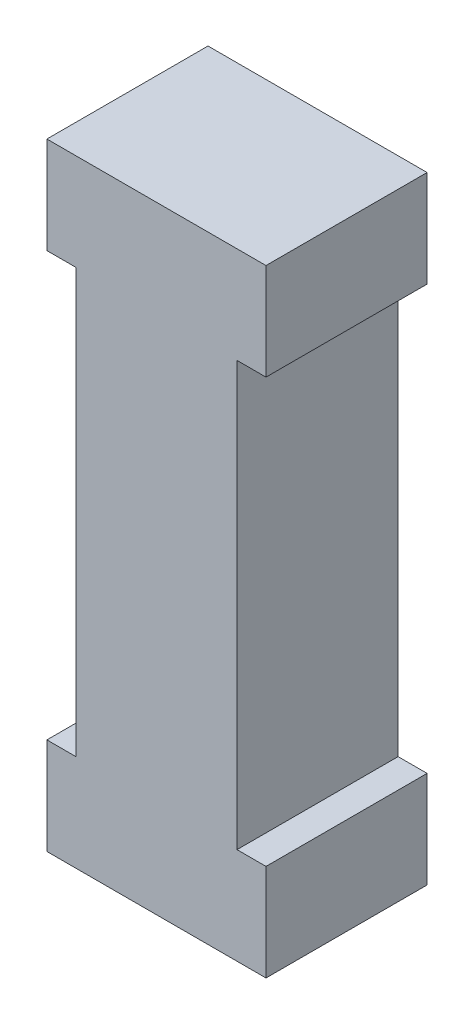
ISO-10303-21;
HEADER;
FILE_DESCRIPTION(('STEP AP214'),'2;1');
FILE_NAME('part.step','',(''),(''),'','','');
FILE_SCHEMA(('AUTOMOTIVE_DESIGN { 1 0 10303 214 1 1 1 1 }'));
ENDSEC;
DATA;
#1=APPLICATION_CONTEXT('core data for automotive mechanical design processes');
#2=APPLICATION_PROTOCOL_DEFINITION('international standard','automotive_design',2000,#1);
#3=PRODUCT_CONTEXT('',#1,'mechanical');
#4=PRODUCT('Part','Part','',(#3));
#5=PRODUCT_RELATED_PRODUCT_CATEGORY('part','',(#4));
#6=PRODUCT_DEFINITION_FORMATION('','',#4);
#7=PRODUCT_DEFINITION_CONTEXT('part definition',#1,'design');
#8=PRODUCT_DEFINITION('design','',#6,#7);
#9=PRODUCT_DEFINITION_SHAPE('','',#8);
#10=(LENGTH_UNIT() NAMED_UNIT(*) SI_UNIT(.MILLI.,.METRE.));
#11=(NAMED_UNIT(*) PLANE_ANGLE_UNIT() SI_UNIT($,.RADIAN.));
#12=(NAMED_UNIT(*) SI_UNIT($,.STERADIAN.) SOLID_ANGLE_UNIT());
#13=UNCERTAINTY_MEASURE_WITH_UNIT(LENGTH_MEASURE(1.E-05),#10,'distance_accuracy_value','');
#14=(GEOMETRIC_REPRESENTATION_CONTEXT(3) GLOBAL_UNCERTAINTY_ASSIGNED_CONTEXT((#13)) GLOBAL_UNIT_ASSIGNED_CONTEXT((#10,
#11,#12)) REPRESENTATION_CONTEXT('',''));
#15=CARTESIAN_POINT('',(0.,0.,0.));
#16=DIRECTION('',(0.,0.,1.));
#17=DIRECTION('',(1.,0.,0.));
#18=AXIS2_PLACEMENT_3D('',#15,#16,#17);
#19=CARTESIAN_POINT('',(0.,0.,5.));
#20=DIRECTION('',(0.,-1.,0.));
#21=DIRECTION('',(1.,0.,0.));
#22=AXIS2_PLACEMENT_3D('',#19,#20,#21);
#23=PLANE('',#22);
#24=DIRECTION('',(-1.,0.,0.));
#25=VECTOR('',#24,1.);
#26=CARTESIAN_POINT('',(0.,0.,0.));
#27=LINE('',#26,#25);
#28=CARTESIAN_POINT('',(0.900000000000002,0.,0.));
#29=VERTEX_POINT('',#28);
#30=CARTESIAN_POINT('',(0.,0.,0.));
#31=VERTEX_POINT('',#30);
#32=EDGE_CURVE('E159',#29,#31,#27,.T.);
#33=ORIENTED_EDGE('',*,*,#32,.T.);
#34=DIRECTION('',(0.,0.,-1.));
#35=VECTOR('',#34,1.);
#36=CARTESIAN_POINT('',(0.,0.,5.));
#37=LINE('',#36,#35);
#38=CARTESIAN_POINT('',(0.,0.,5.));
#39=VERTEX_POINT('',#38);
#40=EDGE_CURVE('E11',#39,#31,#37,.T.);
#41=ORIENTED_EDGE('',*,*,#40,.F.);
#42=DIRECTION('',(-1.,0.,0.));
#43=VECTOR('',#42,1.);
#44=CARTESIAN_POINT('',(0.,0.,5.));
#45=LINE('',#44,#43);
#46=CARTESIAN_POINT('',(0.900000000000002,0.,5.));
#47=VERTEX_POINT('',#46);
#48=EDGE_CURVE('E181',#47,#39,#45,.T.);
#49=ORIENTED_EDGE('',*,*,#48,.F.);
#50=DIRECTION('',(0.,0.,-1.));
#51=VECTOR('',#50,1.);
#52=CARTESIAN_POINT('',(0.900000000000002,0.,5.));
#53=LINE('',#52,#51);
#54=EDGE_CURVE('E155',#47,#29,#53,.T.);
#55=ORIENTED_EDGE('',*,*,#54,.T.);
#56=EDGE_LOOP('',(#33,#41,#49,#55));
#57=FACE_BOUND('',#56,.T.);
#58=ADVANCED_FACE('F39',(#57),#23,.F.);
#59=CARTESIAN_POINT('',(0.,0.,5.));
#60=DIRECTION('',(-1.,0.,0.));
#61=DIRECTION('',(0.,0.,1.));
#62=AXIS2_PLACEMENT_3D('',#59,#60,#61);
#63=PLANE('',#62);
#64=DIRECTION('',(0.,1.,0.));
#65=VECTOR('',#64,1.);
#66=CARTESIAN_POINT('',(0.,0.,0.));
#67=LINE('',#66,#65);
#68=CARTESIAN_POINT('',(0.,13.15,0.));
#69=VERTEX_POINT('',#68);
#70=EDGE_CURVE('E162',#31,#69,#67,.T.);
#71=ORIENTED_EDGE('',*,*,#70,.T.);
#72=DIRECTION('',(0.,0.,-1.));
#73=VECTOR('',#72,1.);
#74=CARTESIAN_POINT('',(0.,13.15,5.));
#75=LINE('',#74,#73);
#76=CARTESIAN_POINT('',(0.,13.15,5.));
#77=VERTEX_POINT('',#76);
#78=EDGE_CURVE('E47',#77,#69,#75,.T.);
#79=ORIENTED_EDGE('',*,*,#78,.F.);
#80=DIRECTION('',(0.,1.,0.));
#81=VECTOR('',#80,1.);
#82=CARTESIAN_POINT('',(0.,0.,5.));
#83=LINE('',#82,#81);
#84=EDGE_CURVE('E110',#39,#77,#83,.T.);
#85=ORIENTED_EDGE('',*,*,#84,.F.);
#86=ORIENTED_EDGE('',*,*,#40,.T.);
#87=EDGE_LOOP('',(#71,#79,#85,#86));
#88=FACE_BOUND('',#87,.T.);
#89=ADVANCED_FACE('F259',(#88),#63,.F.);
#90=CARTESIAN_POINT('',(0.,13.15,5.));
#91=DIRECTION('',(0.,1.,0.));
#92=DIRECTION('',(-1.,0.,0.));
#93=AXIS2_PLACEMENT_3D('',#90,#91,#92);
#94=PLANE('',#93);
#95=DIRECTION('',(1.,0.,0.));
#96=VECTOR('',#95,1.);
#97=CARTESIAN_POINT('',(0.,13.15,0.));
#98=LINE('',#97,#96);
#99=CARTESIAN_POINT('',(0.899999999999993,13.15,0.));
#100=VERTEX_POINT('',#99);
#101=EDGE_CURVE('E164',#69,#100,#98,.T.);
#102=ORIENTED_EDGE('',*,*,#101,.T.);
#103=DIRECTION('',(0.,0.,-1.));
#104=VECTOR('',#103,1.);
#105=CARTESIAN_POINT('',(0.899999999999993,13.15,5.));
#106=LINE('',#105,#104);
#107=CARTESIAN_POINT('',(0.899999999999993,13.15,5.));
#108=VERTEX_POINT('',#107);
#109=EDGE_CURVE('E200',#108,#100,#106,.T.);
#110=ORIENTED_EDGE('',*,*,#109,.F.);
#111=DIRECTION('',(1.,0.,0.));
#112=VECTOR('',#111,1.);
#113=CARTESIAN_POINT('',(0.,13.15,5.));
#114=LINE('',#113,#112);
#115=EDGE_CURVE('E208',#77,#108,#114,.T.);
#116=ORIENTED_EDGE('',*,*,#115,.F.);
#117=ORIENTED_EDGE('',*,*,#78,.T.);
#118=EDGE_LOOP('',(#102,#110,#116,#117));
#119=FACE_BOUND('',#118,.T.);
#120=ADVANCED_FACE('F206',(#119),#94,.F.);
#121=CARTESIAN_POINT('',(0.899999999999991,16.15,5.));
#122=DIRECTION('',(-1.,0.,0.));
#123=DIRECTION('',(0.,-1.,0.));
#124=AXIS2_PLACEMENT_3D('',#121,#122,#123);
#125=PLANE('',#124);
#126=DIRECTION('',(0.,1.,0.));
#127=VECTOR('',#126,1.);
#128=CARTESIAN_POINT('',(0.899999999999991,16.15,0.));
#129=LINE('',#128,#127);
#130=CARTESIAN_POINT('',(0.899999999999991,16.15,0.));
#131=VERTEX_POINT('',#130);
#132=EDGE_CURVE('E166',#100,#131,#129,.T.);
#133=ORIENTED_EDGE('',*,*,#132,.T.);
#134=DIRECTION('',(0.,0.,-1.));
#135=VECTOR('',#134,1.);
#136=CARTESIAN_POINT('',(0.899999999999991,16.15,5.));
#137=LINE('',#136,#135);
#138=CARTESIAN_POINT('',(0.899999999999991,16.15,5.));
#139=VERTEX_POINT('',#138);
#140=EDGE_CURVE('E197',#139,#131,#137,.T.);
#141=ORIENTED_EDGE('',*,*,#140,.F.);
#142=DIRECTION('',(0.,1.,0.));
#143=VECTOR('',#142,1.);
#144=CARTESIAN_POINT('',(0.899999999999991,16.15,5.));
#145=LINE('',#144,#143);
#146=EDGE_CURVE('E226',#108,#139,#145,.T.);
#147=ORIENTED_EDGE('',*,*,#146,.F.);
#148=ORIENTED_EDGE('',*,*,#109,.T.);
#149=EDGE_LOOP('',(#133,#141,#147,#148));
#150=FACE_BOUND('',#149,.T.);
#151=ADVANCED_FACE('F217',(#150),#125,.F.);
#152=CARTESIAN_POINT('',(-5.90000000000001,16.15,5.));
#153=DIRECTION('',(0.,-1.,0.));
#154=DIRECTION('',(1.,0.,0.));
#155=AXIS2_PLACEMENT_3D('',#152,#153,#154);
#156=PLANE('',#155);
#157=DIRECTION('',(-1.,0.,0.));
#158=VECTOR('',#157,1.);
#159=CARTESIAN_POINT('',(-5.90000000000001,16.15,0.));
#160=LINE('',#159,#158);
#161=CARTESIAN_POINT('',(-5.90000000000001,16.15,0.));
#162=VERTEX_POINT('',#161);
#163=EDGE_CURVE('E168',#131,#162,#160,.T.);
#164=ORIENTED_EDGE('',*,*,#163,.T.);
#165=DIRECTION('',(0.,0.,-1.));
#166=VECTOR('',#165,1.);
#167=CARTESIAN_POINT('',(-5.90000000000001,16.15,5.));
#168=LINE('',#167,#166);
#169=CARTESIAN_POINT('',(-5.90000000000001,16.15,5.));
#170=VERTEX_POINT('',#169);
#171=EDGE_CURVE('E194',#170,#162,#168,.T.);
#172=ORIENTED_EDGE('',*,*,#171,.F.);
#173=DIRECTION('',(-1.,0.,0.));
#174=VECTOR('',#173,1.);
#175=CARTESIAN_POINT('',(-5.90000000000001,16.15,5.));
#176=LINE('',#175,#174);
#177=EDGE_CURVE('E223',#139,#170,#176,.T.);
#178=ORIENTED_EDGE('',*,*,#177,.F.);
#179=ORIENTED_EDGE('',*,*,#140,.T.);
#180=EDGE_LOOP('',(#164,#172,#178,#179));
#181=FACE_BOUND('',#180,.T.);
#182=ADVANCED_FACE('F221',(#181),#156,.F.);
#183=CARTESIAN_POINT('',(-5.90000000000001,16.15,5.));
#184=DIRECTION('',(1.,0.,0.));
#185=DIRECTION('',(0.,0.,-1.));
#186=AXIS2_PLACEMENT_3D('',#183,#184,#185);
#187=PLANE('',#186);
#188=DIRECTION('',(0.,-1.,0.));
#189=VECTOR('',#188,1.);
#190=CARTESIAN_POINT('',(-5.90000000000001,16.15,0.));
#191=LINE('',#190,#189);
#192=CARTESIAN_POINT('',(-5.90000000000001,13.15,0.));
#193=VERTEX_POINT('',#192);
#194=EDGE_CURVE('E170',#162,#193,#191,.T.);
#195=ORIENTED_EDGE('',*,*,#194,.T.);
#196=DIRECTION('',(0.,0.,-1.));
#197=VECTOR('',#196,1.);
#198=CARTESIAN_POINT('',(-5.90000000000001,13.15,5.));
#199=LINE('',#198,#197);
#200=CARTESIAN_POINT('',(-5.90000000000001,13.15,5.));
#201=VERTEX_POINT('',#200);
#202=EDGE_CURVE('E191',#201,#193,#199,.T.);
#203=ORIENTED_EDGE('',*,*,#202,.F.);
#204=DIRECTION('',(0.,-1.,0.));
#205=VECTOR('',#204,1.);
#206=CARTESIAN_POINT('',(-5.90000000000001,16.15,5.));
#207=LINE('',#206,#205);
#208=EDGE_CURVE('E225',#170,#201,#207,.T.);
#209=ORIENTED_EDGE('',*,*,#208,.F.);
#210=ORIENTED_EDGE('',*,*,#171,.T.);
#211=EDGE_LOOP('',(#195,#203,#209,#210));
#212=FACE_BOUND('',#211,.T.);
#213=ADVANCED_FACE('F272',(#212),#187,.F.);
#214=CARTESIAN_POINT('',(-5.90000000000001,13.15,5.));
#215=DIRECTION('',(0.,1.,0.));
#216=DIRECTION('',(0.,0.,1.));
#217=AXIS2_PLACEMENT_3D('',#214,#215,#216);
#218=PLANE('',#217);
#219=DIRECTION('',(1.,0.,0.));
#220=VECTOR('',#219,1.);
#221=CARTESIAN_POINT('',(-5.90000000000001,13.15,0.));
#222=LINE('',#221,#220);
#223=CARTESIAN_POINT('',(-5.,13.15,0.));
#224=VERTEX_POINT('',#223);
#225=EDGE_CURVE('E172',#193,#224,#222,.T.);
#226=ORIENTED_EDGE('',*,*,#225,.T.);
#227=DIRECTION('',(0.,0.,-1.));
#228=VECTOR('',#227,1.);
#229=CARTESIAN_POINT('',(-5.,13.15,5.));
#230=LINE('',#229,#228);
#231=CARTESIAN_POINT('',(-5.,13.15,5.));
#232=VERTEX_POINT('',#231);
#233=EDGE_CURVE('E188',#232,#224,#230,.T.);
#234=ORIENTED_EDGE('',*,*,#233,.F.);
#235=DIRECTION('',(1.,0.,0.));
#236=VECTOR('',#235,1.);
#237=CARTESIAN_POINT('',(-5.90000000000001,13.15,5.));
#238=LINE('',#237,#236);
#239=EDGE_CURVE('E228',#201,#232,#238,.T.);
#240=ORIENTED_EDGE('',*,*,#239,.F.);
#241=ORIENTED_EDGE('',*,*,#202,.T.);
#242=EDGE_LOOP('',(#226,#234,#240,#241));
#243=FACE_BOUND('',#242,.T.);
#244=ADVANCED_FACE('F275',(#243),#218,.F.);
#245=CARTESIAN_POINT('',(-5.,0.,5.));
#246=DIRECTION('',(1.,0.,0.));
#247=DIRECTION('',(0.,1.,0.));
#248=AXIS2_PLACEMENT_3D('',#245,#246,#247);
#249=PLANE('',#248);
#250=DIRECTION('',(0.,-1.,0.));
#251=VECTOR('',#250,1.);
#252=CARTESIAN_POINT('',(-5.,0.,0.));
#253=LINE('',#252,#251);
#254=CARTESIAN_POINT('',(-5.,0.,0.));
#255=VERTEX_POINT('',#254);
#256=EDGE_CURVE('E174',#224,#255,#253,.T.);
#257=ORIENTED_EDGE('',*,*,#256,.T.);
#258=DIRECTION('',(0.,0.,-1.));
#259=VECTOR('',#258,1.);
#260=CARTESIAN_POINT('',(-5.,0.,5.));
#261=LINE('',#260,#259);
#262=CARTESIAN_POINT('',(-5.,0.,5.));
#263=VERTEX_POINT('',#262);
#264=EDGE_CURVE('E185',#263,#255,#261,.T.);
#265=ORIENTED_EDGE('',*,*,#264,.F.);
#266=DIRECTION('',(0.,-1.,0.));
#267=VECTOR('',#266,1.);
#268=CARTESIAN_POINT('',(-5.,0.,5.));
#269=LINE('',#268,#267);
#270=EDGE_CURVE('E234',#232,#263,#269,.T.);
#271=ORIENTED_EDGE('',*,*,#270,.F.);
#272=ORIENTED_EDGE('',*,*,#233,.T.);
#273=EDGE_LOOP('',(#257,#265,#271,#272));
#274=FACE_BOUND('',#273,.T.);
#275=ADVANCED_FACE('F240',(#274),#249,.F.);
#276=CARTESIAN_POINT('',(-5.9,0.,5.));
#277=DIRECTION('',(0.,-1.,0.));
#278=DIRECTION('',(1.,0.,0.));
#279=AXIS2_PLACEMENT_3D('',#276,#277,#278);
#280=PLANE('',#279);
#281=DIRECTION('',(-1.,0.,0.));
#282=VECTOR('',#281,1.);
#283=CARTESIAN_POINT('',(-5.9,0.,0.));
#284=LINE('',#283,#282);
#285=CARTESIAN_POINT('',(-5.9,0.,0.));
#286=VERTEX_POINT('',#285);
#287=EDGE_CURVE('E176',#255,#286,#284,.T.);
#288=ORIENTED_EDGE('',*,*,#287,.T.);
#289=DIRECTION('',(0.,0.,-1.));
#290=VECTOR('',#289,1.);
#291=CARTESIAN_POINT('',(-5.9,0.,5.));
#292=LINE('',#291,#290);
#293=CARTESIAN_POINT('',(-5.9,0.,5.));
#294=VERTEX_POINT('',#293);
#295=EDGE_CURVE('E150',#294,#286,#292,.T.);
#296=ORIENTED_EDGE('',*,*,#295,.F.);
#297=DIRECTION('',(-1.,0.,0.));
#298=VECTOR('',#297,1.);
#299=CARTESIAN_POINT('',(-5.9,0.,5.));
#300=LINE('',#299,#298);
#301=EDGE_CURVE('E141',#263,#294,#300,.T.);
#302=ORIENTED_EDGE('',*,*,#301,.F.);
#303=ORIENTED_EDGE('',*,*,#264,.T.);
#304=EDGE_LOOP('',(#288,#296,#302,#303));
#305=FACE_BOUND('',#304,.T.);
#306=ADVANCED_FACE('F244',(#305),#280,.F.);
#307=CARTESIAN_POINT('',(-5.9,-3.,5.));
#308=DIRECTION('',(1.,0.,0.));
#309=DIRECTION('',(0.,0.,-1.));
#310=AXIS2_PLACEMENT_3D('',#307,#308,#309);
#311=PLANE('',#310);
#312=DIRECTION('',(0.,-1.,0.));
#313=VECTOR('',#312,1.);
#314=CARTESIAN_POINT('',(-5.9,-3.,0.));
#315=LINE('',#314,#313);
#316=CARTESIAN_POINT('',(-5.9,-3.,0.));
#317=VERTEX_POINT('',#316);
#318=EDGE_CURVE('E149',#286,#317,#315,.T.);
#319=ORIENTED_EDGE('',*,*,#318,.T.);
#320=DIRECTION('',(0.,0.,-1.));
#321=VECTOR('',#320,1.);
#322=CARTESIAN_POINT('',(-5.9,-3.,5.));
#323=LINE('',#322,#321);
#324=CARTESIAN_POINT('',(-5.9,-3.,5.));
#325=VERTEX_POINT('',#324);
#326=EDGE_CURVE('E146',#325,#317,#323,.T.);
#327=ORIENTED_EDGE('',*,*,#326,.F.);
#328=DIRECTION('',(0.,-1.,0.));
#329=VECTOR('',#328,1.);
#330=CARTESIAN_POINT('',(-5.9,-3.,5.));
#331=LINE('',#330,#329);
#332=EDGE_CURVE('E135',#294,#325,#331,.T.);
#333=ORIENTED_EDGE('',*,*,#332,.F.);
#334=ORIENTED_EDGE('',*,*,#295,.T.);
#335=EDGE_LOOP('',(#319,#327,#333,#334));
#336=FACE_BOUND('',#335,.T.);
#337=ADVANCED_FACE('F147',(#336),#311,.F.);
#338=CARTESIAN_POINT('',(-5.9,-3.,5.));
#339=DIRECTION('',(0.,1.,0.));
#340=DIRECTION('',(-1.,0.,0.));
#341=AXIS2_PLACEMENT_3D('',#338,#339,#340);
#342=PLANE('',#341);
#343=DIRECTION('',(1.,0.,0.));
#344=VECTOR('',#343,1.);
#345=CARTESIAN_POINT('',(-5.9,-3.,0.));
#346=LINE('',#345,#344);
#347=CARTESIAN_POINT('',(0.900000000000002,-3.,0.));
#348=VERTEX_POINT('',#347);
#349=EDGE_CURVE('E96',#317,#348,#346,.T.);
#350=ORIENTED_EDGE('',*,*,#349,.T.);
#351=DIRECTION('',(0.,0.,-1.));
#352=VECTOR('',#351,1.);
#353=CARTESIAN_POINT('',(0.900000000000002,-3.,5.));
#354=LINE('',#353,#352);
#355=CARTESIAN_POINT('',(0.900000000000002,-3.,5.));
#356=VERTEX_POINT('',#355);
#357=EDGE_CURVE('E151',#356,#348,#354,.T.);
#358=ORIENTED_EDGE('',*,*,#357,.F.);
#359=DIRECTION('',(1.,0.,0.));
#360=VECTOR('',#359,1.);
#361=CARTESIAN_POINT('',(-5.9,-3.,5.));
#362=LINE('',#361,#360);
#363=EDGE_CURVE('E139',#325,#356,#362,.T.);
#364=ORIENTED_EDGE('',*,*,#363,.F.);
#365=ORIENTED_EDGE('',*,*,#326,.T.);
#366=EDGE_LOOP('',(#350,#358,#364,#365));
#367=FACE_BOUND('',#366,.T.);
#368=ADVANCED_FACE('F153',(#367),#342,.F.);
#369=CARTESIAN_POINT('',(0.900000000000002,-3.,5.));
#370=DIRECTION('',(-1.,0.,0.));
#371=DIRECTION('',(0.,0.,1.));
#372=AXIS2_PLACEMENT_3D('',#369,#370,#371);
#373=PLANE('',#372);
#374=DIRECTION('',(0.,1.,0.));
#375=VECTOR('',#374,1.);
#376=CARTESIAN_POINT('',(0.900000000000002,-3.,0.));
#377=LINE('',#376,#375);
#378=EDGE_CURVE('E102',#348,#29,#377,.T.);
#379=ORIENTED_EDGE('',*,*,#378,.T.);
#380=ORIENTED_EDGE('',*,*,#54,.F.);
#381=DIRECTION('',(0.,1.,0.));
#382=VECTOR('',#381,1.);
#383=CARTESIAN_POINT('',(0.900000000000002,-3.,5.));
#384=LINE('',#383,#382);
#385=EDGE_CURVE('E55',#356,#47,#384,.T.);
#386=ORIENTED_EDGE('',*,*,#385,.F.);
#387=ORIENTED_EDGE('',*,*,#357,.T.);
#388=EDGE_LOOP('',(#379,#380,#386,#387));
#389=FACE_BOUND('',#388,.T.);
#390=ADVANCED_FACE('F248',(#389),#373,.F.);
#391=CARTESIAN_POINT('',(0.,0.,5.));
#392=DIRECTION('',(0.,0.,1.));
#393=DIRECTION('',(1.,0.,0.));
#394=AXIS2_PLACEMENT_3D('',#391,#392,#393);
#395=PLANE('',#394);
#396=ORIENTED_EDGE('',*,*,#48,.T.);
#397=ORIENTED_EDGE('',*,*,#84,.T.);
#398=ORIENTED_EDGE('',*,*,#115,.T.);
#399=ORIENTED_EDGE('',*,*,#146,.T.);
#400=ORIENTED_EDGE('',*,*,#177,.T.);
#401=ORIENTED_EDGE('',*,*,#208,.T.);
#402=ORIENTED_EDGE('',*,*,#239,.T.);
#403=ORIENTED_EDGE('',*,*,#270,.T.);
#404=ORIENTED_EDGE('',*,*,#301,.T.);
#405=ORIENTED_EDGE('',*,*,#332,.T.);
#406=ORIENTED_EDGE('',*,*,#363,.T.);
#407=ORIENTED_EDGE('',*,*,#385,.T.);
#408=EDGE_LOOP('',(#396,#397,#398,#399,#400,#401,#402,#403,#404,#405,#406,#407));
#409=FACE_BOUND('',#408,.T.);
#410=ADVANCED_FACE('F137',(#409),#395,.T.);
#411=CARTESIAN_POINT('',(0.,0.,0.));
#412=DIRECTION('',(0.,0.,1.));
#413=DIRECTION('',(1.,0.,0.));
#414=AXIS2_PLACEMENT_3D('',#411,#412,#413);
#415=PLANE('',#414);
#416=ORIENTED_EDGE('',*,*,#32,.F.);
#417=ORIENTED_EDGE('',*,*,#378,.F.);
#418=ORIENTED_EDGE('',*,*,#349,.F.);
#419=ORIENTED_EDGE('',*,*,#318,.F.);
#420=ORIENTED_EDGE('',*,*,#287,.F.);
#421=ORIENTED_EDGE('',*,*,#256,.F.);
#422=ORIENTED_EDGE('',*,*,#225,.F.);
#423=ORIENTED_EDGE('',*,*,#194,.F.);
#424=ORIENTED_EDGE('',*,*,#163,.F.);
#425=ORIENTED_EDGE('',*,*,#132,.F.);
#426=ORIENTED_EDGE('',*,*,#101,.F.);
#427=ORIENTED_EDGE('',*,*,#70,.F.);
#428=EDGE_LOOP('',(#416,#417,#418,#419,#420,#421,#422,#423,#424,#425,#426,#427));
#429=FACE_BOUND('',#428,.T.);
#430=ADVANCED_FACE('F212',(#429),#415,.F.);
#431=CLOSED_SHELL('',(#58,#89,#120,#151,#182,#213,#244,#275,#306,#337,#368,#390,#410,#430));
#432=MANIFOLD_SOLID_BREP('B2',#431);
#433=ADVANCED_BREP_SHAPE_REPRESENTATION('',(#18,#432),#14);
#434=SHAPE_DEFINITION_REPRESENTATION(#9,#433);
ENDSEC;
END-ISO-10303-21;
